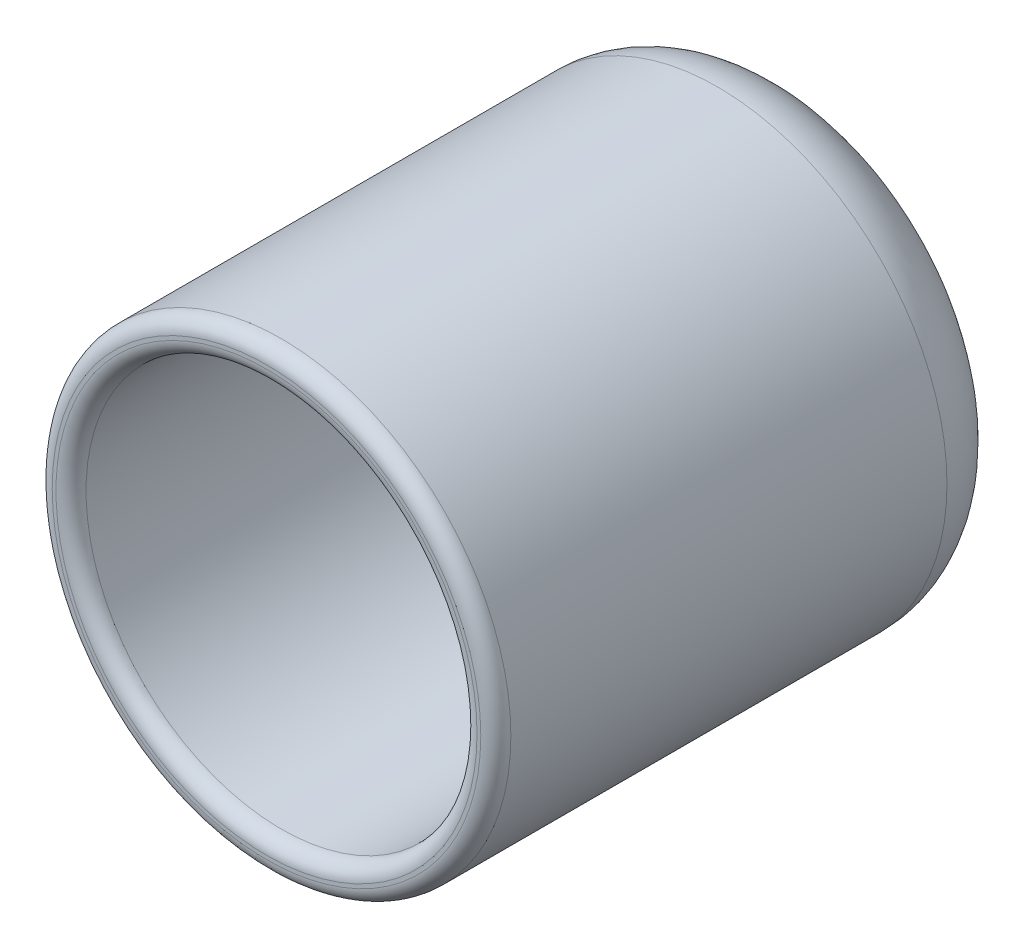
ISO-10303-21;
HEADER;
FILE_DESCRIPTION(('STEP AP214'),'2;1');
FILE_NAME('part.step','',(''),(''),'','','');
FILE_SCHEMA(('AUTOMOTIVE_DESIGN { 1 0 10303 214 1 1 1 1 }'));
ENDSEC;
DATA;
#1=APPLICATION_CONTEXT('core data for automotive mechanical design processes');
#2=APPLICATION_PROTOCOL_DEFINITION('international standard','automotive_design',2000,#1);
#3=PRODUCT_CONTEXT('',#1,'mechanical');
#4=PRODUCT('Part','Part','',(#3));
#5=PRODUCT_RELATED_PRODUCT_CATEGORY('part','',(#4));
#6=PRODUCT_DEFINITION_FORMATION('','',#4);
#7=PRODUCT_DEFINITION_CONTEXT('part definition',#1,'design');
#8=PRODUCT_DEFINITION('design','',#6,#7);
#9=PRODUCT_DEFINITION_SHAPE('','',#8);
#10=(LENGTH_UNIT() NAMED_UNIT(*) SI_UNIT(.MILLI.,.METRE.));
#11=(NAMED_UNIT(*) PLANE_ANGLE_UNIT() SI_UNIT($,.RADIAN.));
#12=(NAMED_UNIT(*) SI_UNIT($,.STERADIAN.) SOLID_ANGLE_UNIT());
#13=UNCERTAINTY_MEASURE_WITH_UNIT(LENGTH_MEASURE(1.E-05),#10,'distance_accuracy_value','');
#14=(GEOMETRIC_REPRESENTATION_CONTEXT(3) GLOBAL_UNCERTAINTY_ASSIGNED_CONTEXT((#13)) GLOBAL_UNIT_ASSIGNED_CONTEXT((#10,
#11,#12)) REPRESENTATION_CONTEXT('',''));
#15=CARTESIAN_POINT('',(0.,0.,0.));
#16=DIRECTION('',(0.,0.,1.));
#17=DIRECTION('',(1.,0.,0.));
#18=AXIS2_PLACEMENT_3D('',#15,#16,#17);
#19=CARTESIAN_POINT('',(0.,0.,7.));
#20=DIRECTION('',(0.,0.,-1.));
#21=DIRECTION('',(-1.,0.,0.));
#22=AXIS2_PLACEMENT_3D('',#19,#20,#21);
#23=CYLINDRICAL_SURFACE('',#22,3.05);
#24=CARTESIAN_POINT('',(0.,0.,1.));
#25=DIRECTION('',(0.,0.,1.));
#26=DIRECTION('',(1.,0.,0.));
#27=AXIS2_PLACEMENT_3D('',#24,#25,#26);
#28=CIRCLE('',#27,3.05);
#29=CARTESIAN_POINT('',(3.05,0.,1.));
#30=VERTEX_POINT('',#29);
#31=EDGE_CURVE('E38',#30,#30,#28,.T.);
#32=ORIENTED_EDGE('',*,*,#31,.T.);
#33=EDGE_LOOP('',(#32));
#34=FACE_BOUND('',#33,.T.);
#35=CARTESIAN_POINT('',(0.,0.,6.8));
#36=DIRECTION('',(0.,0.,1.));
#37=DIRECTION('',(1.,0.,0.));
#38=AXIS2_PLACEMENT_3D('',#35,#36,#37);
#39=CIRCLE('',#38,3.05);
#40=CARTESIAN_POINT('',(3.05,0.,6.8));
#41=VERTEX_POINT('',#40);
#42=EDGE_CURVE('E42',#41,#41,#39,.F.);
#43=ORIENTED_EDGE('',*,*,#42,.T.);
#44=EDGE_LOOP('',(#43));
#45=FACE_BOUND('',#44,.T.);
#46=ADVANCED_FACE('F31',(#34,#45),#23,.T.);
#47=CARTESIAN_POINT('',(0.,0.,7.));
#48=DIRECTION('',(0.,0.,1.));
#49=DIRECTION('',(1.,0.,0.));
#50=AXIS2_PLACEMENT_3D('',#47,#48,#49);
#51=PLANE('',#50);
#52=CARTESIAN_POINT('',(0.,0.,7.));
#53=DIRECTION('',(0.,0.,1.));
#54=DIRECTION('',(1.,0.,0.));
#55=AXIS2_PLACEMENT_3D('',#52,#53,#54);
#56=CIRCLE('',#55,2.8);
#57=CARTESIAN_POINT('',(2.8,0.,7.));
#58=VERTEX_POINT('',#57);
#59=EDGE_CURVE('E46',#58,#58,#56,.F.);
#60=ORIENTED_EDGE('',*,*,#59,.T.);
#61=EDGE_LOOP('',(#60));
#62=FACE_BOUND('',#61,.T.);
#63=CARTESIAN_POINT('',(0.,0.,7.));
#64=DIRECTION('',(0.,0.,1.));
#65=DIRECTION('',(1.,0.,0.));
#66=AXIS2_PLACEMENT_3D('',#63,#64,#65);
#67=CIRCLE('',#66,2.85);
#68=CARTESIAN_POINT('',(2.85,0.,7.));
#69=VERTEX_POINT('',#68);
#70=EDGE_CURVE('E51',#69,#69,#67,.T.);
#71=ORIENTED_EDGE('',*,*,#70,.T.);
#72=EDGE_LOOP('',(#71));
#73=FACE_BOUND('',#72,.T.);
#74=ADVANCED_FACE('F74',(#62,#73),#51,.T.);
#75=CARTESIAN_POINT('',(0.,0.,0.));
#76=DIRECTION('',(0.,0.,1.));
#77=DIRECTION('',(1.,0.,0.));
#78=AXIS2_PLACEMENT_3D('',#75,#76,#77);
#79=PLANE('',#78);
#80=CARTESIAN_POINT('',(0.,0.,0.));
#81=DIRECTION('',(0.,0.,1.));
#82=DIRECTION('',(1.,0.,0.));
#83=AXIS2_PLACEMENT_3D('',#80,#81,#82);
#84=CIRCLE('',#83,2.05);
#85=CARTESIAN_POINT('',(2.05,0.,0.));
#86=VERTEX_POINT('',#85);
#87=EDGE_CURVE('E10',#86,#86,#84,.F.);
#88=ORIENTED_EDGE('',*,*,#87,.T.);
#89=EDGE_LOOP('',(#88));
#90=FACE_BOUND('',#89,.T.);
#91=ADVANCED_FACE('F65',(#90),#79,.F.);
#92=CARTESIAN_POINT('',(0.,0.,0.5));
#93=DIRECTION('',(0.,0.,1.));
#94=DIRECTION('',(1.,0.,0.));
#95=AXIS2_PLACEMENT_3D('',#92,#93,#94);
#96=CYLINDRICAL_SURFACE('',#95,2.6);
#97=CARTESIAN_POINT('',(0.,0.,6.8));
#98=DIRECTION('',(0.,0.,1.));
#99=DIRECTION('',(1.,0.,0.));
#100=AXIS2_PLACEMENT_3D('',#97,#98,#99);
#101=CIRCLE('',#100,2.6);
#102=CARTESIAN_POINT('',(2.6,0.,6.8));
#103=VERTEX_POINT('',#102);
#104=EDGE_CURVE('E54',#103,#103,#101,.T.);
#105=CARTESIAN_POINT('',(0.,0.,0.5));
#106=DIRECTION('',(0.,0.,1.));
#107=DIRECTION('',(1.,0.,0.));
#108=AXIS2_PLACEMENT_3D('',#105,#106,#107);
#109=CIRCLE('',#108,2.6);
#110=CARTESIAN_POINT('',(2.6,0.,0.5));
#111=VERTEX_POINT('',#110);
#112=EDGE_CURVE('E57',#111,#111,#109,.T.);
#113=CARTESIAN_POINT('',(2.6,0.,6.8));
#114=CARTESIAN_POINT('',(2.6,0.,6.734375));
#115=CARTESIAN_POINT('',(2.6,0.,6.66875));
#116=CARTESIAN_POINT('',(2.6,0.,6.5375));
#117=CARTESIAN_POINT('',(2.6,0.,6.471875));
#118=CARTESIAN_POINT('',(2.6,0.,6.340625));
#119=CARTESIAN_POINT('',(2.6,0.,6.275));
#120=CARTESIAN_POINT('',(2.6,0.,6.14375));
#121=CARTESIAN_POINT('',(2.6,0.,6.078125));
#122=CARTESIAN_POINT('',(2.6,0.,5.946875));
#123=CARTESIAN_POINT('',(2.6,0.,5.88125));
#124=CARTESIAN_POINT('',(2.6,0.,5.75));
#125=CARTESIAN_POINT('',(2.6,0.,5.684375));
#126=CARTESIAN_POINT('',(2.6,0.,5.553125));
#127=CARTESIAN_POINT('',(2.6,0.,5.4875));
#128=CARTESIAN_POINT('',(2.6,0.,5.35625));
#129=CARTESIAN_POINT('',(2.6,0.,5.290625));
#130=CARTESIAN_POINT('',(2.6,0.,5.159375));
#131=CARTESIAN_POINT('',(2.6,0.,5.09375));
#132=CARTESIAN_POINT('',(2.6,0.,4.9625));
#133=CARTESIAN_POINT('',(2.6,0.,4.896875));
#134=CARTESIAN_POINT('',(2.6,0.,4.765625));
#135=CARTESIAN_POINT('',(2.6,0.,4.7));
#136=CARTESIAN_POINT('',(2.6,0.,4.56875));
#137=CARTESIAN_POINT('',(2.6,0.,4.503125));
#138=CARTESIAN_POINT('',(2.6,0.,4.371875));
#139=CARTESIAN_POINT('',(2.6,0.,4.30625));
#140=CARTESIAN_POINT('',(2.6,0.,4.175));
#141=CARTESIAN_POINT('',(2.6,0.,4.109375));
#142=CARTESIAN_POINT('',(2.6,0.,3.978125));
#143=CARTESIAN_POINT('',(2.6,0.,3.9125));
#144=CARTESIAN_POINT('',(2.6,0.,3.78125));
#145=CARTESIAN_POINT('',(2.6,0.,3.715625));
#146=CARTESIAN_POINT('',(2.6,0.,3.584375));
#147=CARTESIAN_POINT('',(2.6,0.,3.51875));
#148=CARTESIAN_POINT('',(2.6,0.,3.3875));
#149=CARTESIAN_POINT('',(2.6,0.,3.321875));
#150=CARTESIAN_POINT('',(2.6,0.,3.190625));
#151=CARTESIAN_POINT('',(2.6,0.,3.125));
#152=CARTESIAN_POINT('',(2.6,0.,2.99375));
#153=CARTESIAN_POINT('',(2.6,0.,2.928125));
#154=CARTESIAN_POINT('',(2.6,0.,2.796875));
#155=CARTESIAN_POINT('',(2.6,0.,2.73125));
#156=CARTESIAN_POINT('',(2.6,0.,2.6));
#157=CARTESIAN_POINT('',(2.6,0.,2.534375));
#158=CARTESIAN_POINT('',(2.6,0.,2.403125));
#159=CARTESIAN_POINT('',(2.6,0.,2.3375));
#160=CARTESIAN_POINT('',(2.6,0.,2.20625));
#161=CARTESIAN_POINT('',(2.6,0.,2.140625));
#162=CARTESIAN_POINT('',(2.6,0.,2.009375));
#163=CARTESIAN_POINT('',(2.6,0.,1.94375));
#164=CARTESIAN_POINT('',(2.6,0.,1.8125));
#165=CARTESIAN_POINT('',(2.6,0.,1.746875));
#166=CARTESIAN_POINT('',(2.6,0.,1.615625));
#167=CARTESIAN_POINT('',(2.6,0.,1.55));
#168=CARTESIAN_POINT('',(2.6,0.,1.41875));
#169=CARTESIAN_POINT('',(2.6,0.,1.353125));
#170=CARTESIAN_POINT('',(2.6,0.,1.221875));
#171=CARTESIAN_POINT('',(2.6,0.,1.15625));
#172=CARTESIAN_POINT('',(2.6,0.,1.025));
#173=CARTESIAN_POINT('',(2.6,0.,0.959375000000001));
#174=CARTESIAN_POINT('',(2.6,0.,0.828125));
#175=CARTESIAN_POINT('',(2.6,0.,0.762500000000001));
#176=CARTESIAN_POINT('',(2.6,0.,0.63125));
#177=CARTESIAN_POINT('',(2.6,0.,0.565625));
#178=CARTESIAN_POINT('',(2.6,0.,0.5));
#179=B_SPLINE_CURVE_WITH_KNOTS('',3,(#113,#114,#115,#116,#117,#118,#119,#120,#121,#122,#123,
#124,#125,#126,#127,#128,#129,#130,#131,#132,#133,#134,#135,#136,#137,#138,#139,#140,#141,#142,
#143,#144,#145,#146,#147,#148,#149,#150,#151,#152,#153,#154,#155,#156,#157,#158,#159,#160,#161,
#162,#163,#164,#165,#166,#167,#168,#169,#170,#171,#172,#173,#174,#175,#176,#177,#178),
.UNSPECIFIED.,.F.,.F.,(4,2,2,2,2,2,2,2,2,2,2,2,2,2,2,2,2,2,2,2,2,2,2,2,2,2,2,2,2,2,2,2,4),(0.,
0.196875,0.39375,0.590625,0.7875,0.984375,1.18125,1.378125,1.575,1.771875,1.96875,2.165625,
2.3625,2.559375,2.75625,2.953125,3.15,3.346875,3.54375,3.740625,3.9375,4.134375,4.33125,
4.528125,4.725,4.921875,5.11875,5.315625,5.5125,5.709375,5.90625,6.103125,6.3),.UNSPECIFIED.);
#180=EDGE_CURVE('BSEAM63',#103,#111,#179,.T.);
#181=ORIENTED_EDGE('',*,*,#104,.T.);
#182=ORIENTED_EDGE('',*,*,#112,.F.);
#183=ORIENTED_EDGE('',*,*,#180,.T.);
#184=ORIENTED_EDGE('',*,*,#180,.F.);
#185=EDGE_LOOP('',(#181,#183,#182,#184));
#186=FACE_BOUND('',#185,.T.);
#187=ADVANCED_FACE('F63',(#186),#96,.F.);
#188=CARTESIAN_POINT('',(0.,0.,0.5));
#189=DIRECTION('',(0.,0.,1.));
#190=DIRECTION('',(1.,0.,0.));
#191=AXIS2_PLACEMENT_3D('',#188,#189,#190);
#192=PLANE('',#191);
#193=ORIENTED_EDGE('',*,*,#112,.T.);
#194=EDGE_LOOP('',(#193));
#195=FACE_BOUND('',#194,.T.);
#196=ADVANCED_FACE('F61',(#195),#192,.T.);
#197=CARTESIAN_POINT('',(0.,0.,6.8));
#198=DIRECTION('',(0.,0.,1.));
#199=DIRECTION('',(1.,0.,0.));
#200=AXIS2_PLACEMENT_3D('',#197,#198,#199);
#201=TOROIDAL_SURFACE('',#200,2.8,0.2);
#202=ORIENTED_EDGE('',*,*,#59,.F.);
#203=EDGE_LOOP('',(#202));
#204=FACE_BOUND('',#203,.T.);
#205=ORIENTED_EDGE('',*,*,#104,.F.);
#206=EDGE_LOOP('',(#205));
#207=FACE_BOUND('',#206,.T.);
#208=ADVANCED_FACE('F72',(#204,#207),#201,.T.);
#209=CARTESIAN_POINT('',(0.,0.,6.8));
#210=DIRECTION('',(0.,0.,1.));
#211=DIRECTION('',(1.,0.,0.));
#212=AXIS2_PLACEMENT_3D('',#209,#210,#211);
#213=TOROIDAL_SURFACE('',#212,2.85,0.2);
#214=ORIENTED_EDGE('',*,*,#42,.F.);
#215=EDGE_LOOP('',(#214));
#216=FACE_BOUND('',#215,.T.);
#217=ORIENTED_EDGE('',*,*,#70,.F.);
#218=EDGE_LOOP('',(#217));
#219=FACE_BOUND('',#218,.T.);
#220=ADVANCED_FACE('F86',(#216,#219),#213,.T.);
#221=CARTESIAN_POINT('',(0.,0.,1.));
#222=DIRECTION('',(0.,0.,1.));
#223=DIRECTION('',(1.,0.,0.));
#224=AXIS2_PLACEMENT_3D('',#221,#222,#223);
#225=TOROIDAL_SURFACE('',#224,2.05,1.);
#226=ORIENTED_EDGE('',*,*,#87,.F.);
#227=EDGE_LOOP('',(#226));
#228=FACE_BOUND('',#227,.T.);
#229=ORIENTED_EDGE('',*,*,#31,.F.);
#230=EDGE_LOOP('',(#229));
#231=FACE_BOUND('',#230,.T.);
#232=ADVANCED_FACE('F33',(#228,#231),#225,.T.);
#233=CLOSED_SHELL('',(#46,#74,#91,#187,#196,#208,#220,#232));
#234=MANIFOLD_SOLID_BREP('B2',#233);
#235=ADVANCED_BREP_SHAPE_REPRESENTATION('',(#18,#234),#14);
#236=SHAPE_DEFINITION_REPRESENTATION(#9,#235);
ENDSEC;
END-ISO-10303-21;
